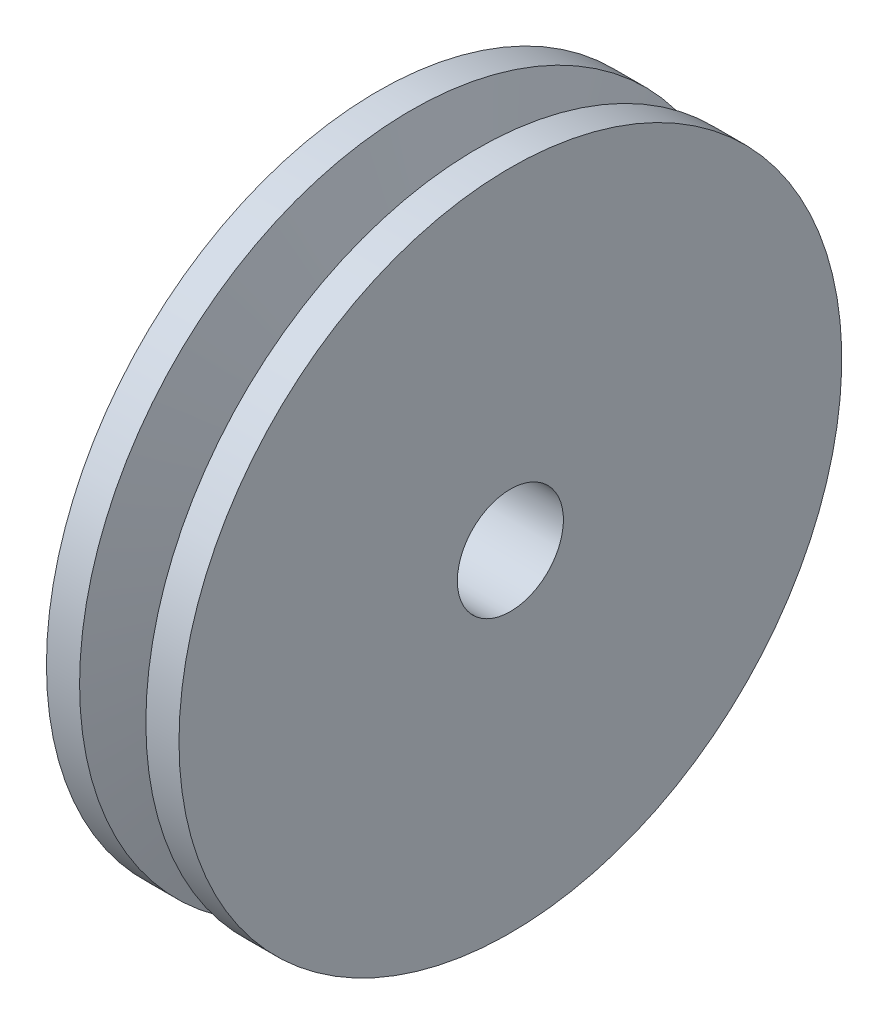
ISO-10303-21;
HEADER;
FILE_DESCRIPTION(('STEP AP214'),'2;1');
FILE_NAME('part.step','',(''),(''),'','','');
FILE_SCHEMA(('AUTOMOTIVE_DESIGN { 1 0 10303 214 1 1 1 1 }'));
ENDSEC;
DATA;
#1=APPLICATION_CONTEXT('core data for automotive mechanical design processes');
#2=APPLICATION_PROTOCOL_DEFINITION('international standard','automotive_design',2000,#1);
#3=PRODUCT_CONTEXT('',#1,'mechanical');
#4=PRODUCT('Part','Part','',(#3));
#5=PRODUCT_RELATED_PRODUCT_CATEGORY('part','',(#4));
#6=PRODUCT_DEFINITION_FORMATION('','',#4);
#7=PRODUCT_DEFINITION_CONTEXT('part definition',#1,'design');
#8=PRODUCT_DEFINITION('design','',#6,#7);
#9=PRODUCT_DEFINITION_SHAPE('','',#8);
#10=(LENGTH_UNIT() NAMED_UNIT(*) SI_UNIT(.MILLI.,.METRE.));
#11=(NAMED_UNIT(*) PLANE_ANGLE_UNIT() SI_UNIT($,.RADIAN.));
#12=(NAMED_UNIT(*) SI_UNIT($,.STERADIAN.) SOLID_ANGLE_UNIT());
#13=UNCERTAINTY_MEASURE_WITH_UNIT(LENGTH_MEASURE(1.E-05),#10,'distance_accuracy_value','');
#14=(GEOMETRIC_REPRESENTATION_CONTEXT(3) GLOBAL_UNCERTAINTY_ASSIGNED_CONTEXT((#13)) GLOBAL_UNIT_ASSIGNED_CONTEXT((#10,
#11,#12)) REPRESENTATION_CONTEXT('',''));
#15=CARTESIAN_POINT('',(0.,0.,0.));
#16=DIRECTION('',(0.,0.,1.));
#17=DIRECTION('',(1.,0.,0.));
#18=AXIS2_PLACEMENT_3D('',#15,#16,#17);
#19=CARTESIAN_POINT('',(-5.,0.,0.));
#20=DIRECTION('',(1.,0.,0.));
#21=DIRECTION('',(0.,0.,-1.));
#22=AXIS2_PLACEMENT_3D('',#19,#20,#21);
#23=PLANE('',#22);
#24=CARTESIAN_POINT('',(-5.,0.,0.));
#25=DIRECTION('',(-1.,0.,0.));
#26=DIRECTION('',(0.,0.,1.));
#27=AXIS2_PLACEMENT_3D('',#24,#25,#26);
#28=CIRCLE('',#27,4.);
#29=CARTESIAN_POINT('',(-5.,0.,4.));
#30=VERTEX_POINT('',#29);
#31=EDGE_CURVE('E58',#30,#30,#28,.T.);
#32=ORIENTED_EDGE('',*,*,#31,.F.);
#33=EDGE_LOOP('',(#32));
#34=FACE_BOUND('',#33,.T.);
#35=CARTESIAN_POINT('',(-5.,0.,0.));
#36=DIRECTION('',(-1.,0.,0.));
#37=DIRECTION('',(0.,0.,1.));
#38=AXIS2_PLACEMENT_3D('',#35,#36,#37);
#39=CIRCLE('',#38,25.);
#40=CARTESIAN_POINT('',(-5.,0.,25.));
#41=VERTEX_POINT('',#40);
#42=EDGE_CURVE('E10',#41,#41,#39,.T.);
#43=ORIENTED_EDGE('',*,*,#42,.T.);
#44=EDGE_LOOP('',(#43));
#45=FACE_BOUND('',#44,.T.);
#46=ADVANCED_FACE('F35',(#34,#45),#23,.F.);
#47=CARTESIAN_POINT('',(-18.9583333333333,0.,0.));
#48=DIRECTION('',(-1.,0.,0.));
#49=DIRECTION('',(0.,0.,1.));
#50=AXIS2_PLACEMENT_3D('',#47,#48,#49);
#51=CYLINDRICAL_SURFACE('',#50,25.);
#52=ORIENTED_EDGE('',*,*,#42,.F.);
#53=EDGE_LOOP('',(#52));
#54=FACE_BOUND('',#53,.T.);
#55=CARTESIAN_POINT('',(-2.5,0.,0.));
#56=DIRECTION('',(-1.,0.,0.));
#57=DIRECTION('',(0.,0.,1.));
#58=AXIS2_PLACEMENT_3D('',#55,#56,#57);
#59=CIRCLE('',#58,25.);
#60=CARTESIAN_POINT('',(-2.5,0.,25.));
#61=VERTEX_POINT('',#60);
#62=EDGE_CURVE('E41',#61,#61,#59,.T.);
#63=ORIENTED_EDGE('',*,*,#62,.T.);
#64=EDGE_LOOP('',(#63));
#65=FACE_BOUND('',#64,.T.);
#66=ADVANCED_FACE('F74',(#54,#65),#51,.T.);
#67=CARTESIAN_POINT('',(0.,0.,0.));
#68=DIRECTION('',(-1.,0.,0.));
#69=DIRECTION('',(0.,0.,1.));
#70=AXIS2_PLACEMENT_3D('',#67,#68,#69);
#71=CONICAL_SURFACE('',#70,15.,1.32581766366803);
#72=ORIENTED_EDGE('',*,*,#62,.F.);
#73=EDGE_LOOP('',(#72));
#74=FACE_BOUND('',#73,.T.);
#75=CARTESIAN_POINT('',(0.,0.,0.));
#76=DIRECTION('',(-1.,0.,0.));
#77=DIRECTION('',(0.,0.,1.));
#78=AXIS2_PLACEMENT_3D('',#75,#76,#77);
#79=CIRCLE('',#78,15.);
#80=CARTESIAN_POINT('',(0.,0.,15.));
#81=VERTEX_POINT('',#80);
#82=EDGE_CURVE('E45',#81,#81,#79,.T.);
#83=ORIENTED_EDGE('',*,*,#82,.T.);
#84=EDGE_LOOP('',(#83));
#85=FACE_BOUND('',#84,.T.);
#86=ADVANCED_FACE('F78',(#74,#85),#71,.T.);
#87=CARTESIAN_POINT('',(2.5,0.,0.));
#88=DIRECTION('',(1.,0.,0.));
#89=DIRECTION('',(0.,0.,-1.));
#90=AXIS2_PLACEMENT_3D('',#87,#88,#89);
#91=CONICAL_SURFACE('',#90,25.,1.32581766366803);
#92=ORIENTED_EDGE('',*,*,#82,.F.);
#93=EDGE_LOOP('',(#92));
#94=FACE_BOUND('',#93,.T.);
#95=CARTESIAN_POINT('',(2.5,0.,0.));
#96=DIRECTION('',(-1.,0.,0.));
#97=DIRECTION('',(0.,0.,1.));
#98=AXIS2_PLACEMENT_3D('',#95,#96,#97);
#99=CIRCLE('',#98,25.);
#100=CARTESIAN_POINT('',(2.5,0.,25.));
#101=VERTEX_POINT('',#100);
#102=EDGE_CURVE('E49',#101,#101,#99,.T.);
#103=ORIENTED_EDGE('',*,*,#102,.T.);
#104=EDGE_LOOP('',(#103));
#105=FACE_BOUND('',#104,.T.);
#106=ADVANCED_FACE('F83',(#94,#105),#91,.T.);
#107=CARTESIAN_POINT('',(-18.9583333333333,0.,0.));
#108=DIRECTION('',(-1.,0.,0.));
#109=DIRECTION('',(0.,0.,1.));
#110=AXIS2_PLACEMENT_3D('',#107,#108,#109);
#111=CYLINDRICAL_SURFACE('',#110,25.);
#112=ORIENTED_EDGE('',*,*,#102,.F.);
#113=EDGE_LOOP('',(#112));
#114=FACE_BOUND('',#113,.T.);
#115=CARTESIAN_POINT('',(5.,0.,0.));
#116=DIRECTION('',(-1.,0.,0.));
#117=DIRECTION('',(0.,0.,1.));
#118=AXIS2_PLACEMENT_3D('',#115,#116,#117);
#119=CIRCLE('',#118,25.);
#120=CARTESIAN_POINT('',(5.,0.,25.));
#121=VERTEX_POINT('',#120);
#122=EDGE_CURVE('E54',#121,#121,#119,.T.);
#123=ORIENTED_EDGE('',*,*,#122,.T.);
#124=EDGE_LOOP('',(#123));
#125=FACE_BOUND('',#124,.T.);
#126=ADVANCED_FACE('F89',(#114,#125),#111,.T.);
#127=CARTESIAN_POINT('',(5.,0.,0.));
#128=DIRECTION('',(-1.,0.,0.));
#129=DIRECTION('',(0.,0.,1.));
#130=AXIS2_PLACEMENT_3D('',#127,#128,#129);
#131=PLANE('',#130);
#132=CARTESIAN_POINT('',(5.,0.,0.));
#133=DIRECTION('',(-1.,0.,0.));
#134=DIRECTION('',(0.,0.,1.));
#135=AXIS2_PLACEMENT_3D('',#132,#133,#134);
#136=CIRCLE('',#135,4.);
#137=CARTESIAN_POINT('',(5.,0.,4.));
#138=VERTEX_POINT('',#137);
#139=EDGE_CURVE('E57',#138,#138,#136,.T.);
#140=ORIENTED_EDGE('',*,*,#139,.T.);
#141=EDGE_LOOP('',(#140));
#142=FACE_BOUND('',#141,.T.);
#143=ORIENTED_EDGE('',*,*,#122,.F.);
#144=EDGE_LOOP('',(#143));
#145=FACE_BOUND('',#144,.T.);
#146=ADVANCED_FACE('F64',(#142,#145),#131,.F.);
#147=CARTESIAN_POINT('',(5.,0.,0.));
#148=DIRECTION('',(-1.,0.,0.));
#149=DIRECTION('',(0.,0.,1.));
#150=AXIS2_PLACEMENT_3D('',#147,#148,#149);
#151=CYLINDRICAL_SURFACE('',#150,4.);
#152=ORIENTED_EDGE('',*,*,#139,.F.);
#153=EDGE_LOOP('',(#152));
#154=FACE_BOUND('',#153,.T.);
#155=ORIENTED_EDGE('',*,*,#31,.T.);
#156=EDGE_LOOP('',(#155));
#157=FACE_BOUND('',#156,.T.);
#158=ADVANCED_FACE('F67',(#154,#157),#151,.F.);
#159=CLOSED_SHELL('',(#46,#66,#86,#106,#126,#146,#158));
#160=MANIFOLD_SOLID_BREP('B2',#159);
#161=ADVANCED_BREP_SHAPE_REPRESENTATION('',(#18,#160),#14);
#162=SHAPE_DEFINITION_REPRESENTATION(#9,#161);
ENDSEC;
END-ISO-10303-21;
